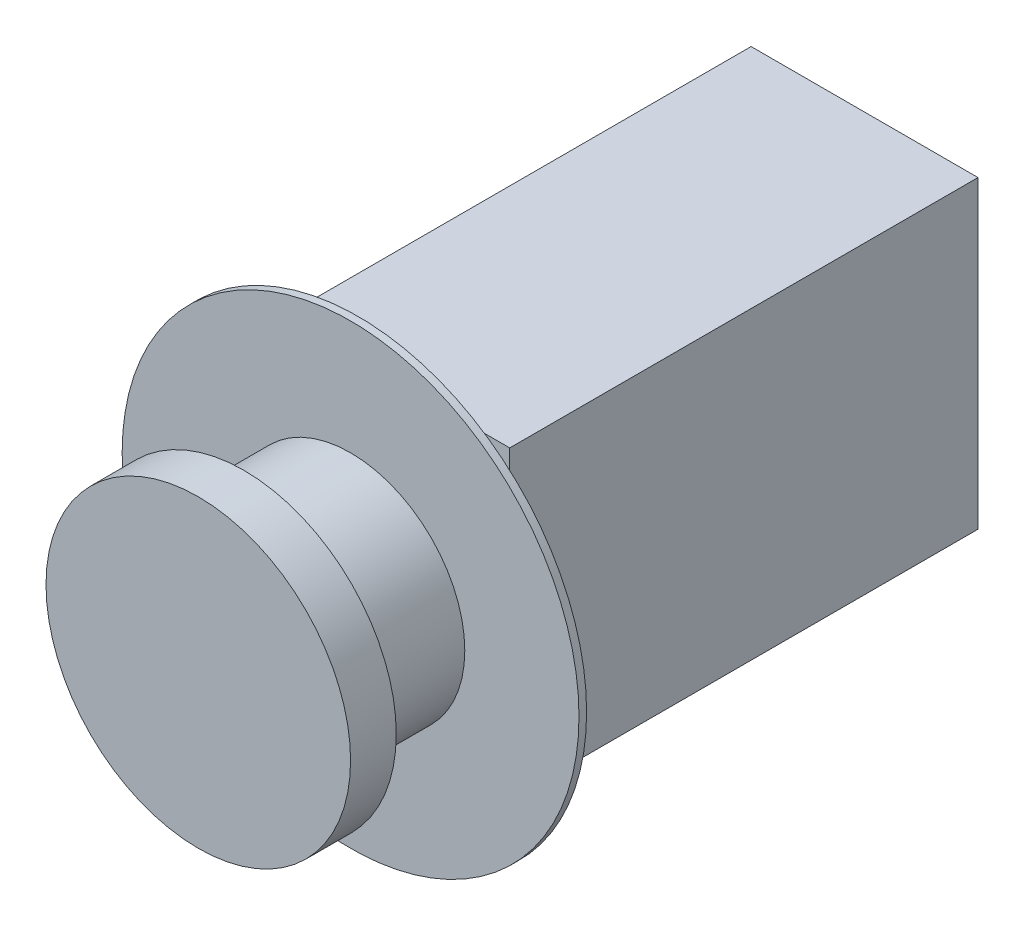
ISO-10303-21;
HEADER;
FILE_DESCRIPTION(('STEP AP214'),'2;1');
FILE_NAME('part.step','',(''),(''),'','','');
FILE_SCHEMA(('AUTOMOTIVE_DESIGN { 1 0 10303 214 1 1 1 1 }'));
ENDSEC;
DATA;
#1=APPLICATION_CONTEXT('core data for automotive mechanical design processes');
#2=APPLICATION_PROTOCOL_DEFINITION('international standard','automotive_design',2000,#1);
#3=PRODUCT_CONTEXT('',#1,'mechanical');
#4=PRODUCT('Part','Part','',(#3));
#5=PRODUCT_RELATED_PRODUCT_CATEGORY('part','',(#4));
#6=PRODUCT_DEFINITION_FORMATION('','',#4);
#7=PRODUCT_DEFINITION_CONTEXT('part definition',#1,'design');
#8=PRODUCT_DEFINITION('design','',#6,#7);
#9=PRODUCT_DEFINITION_SHAPE('','',#8);
#10=(LENGTH_UNIT() NAMED_UNIT(*) SI_UNIT(.MILLI.,.METRE.));
#11=(NAMED_UNIT(*) PLANE_ANGLE_UNIT() SI_UNIT($,.RADIAN.));
#12=(NAMED_UNIT(*) SI_UNIT($,.STERADIAN.) SOLID_ANGLE_UNIT());
#13=UNCERTAINTY_MEASURE_WITH_UNIT(LENGTH_MEASURE(1.E-05),#10,'distance_accuracy_value','');
#14=(GEOMETRIC_REPRESENTATION_CONTEXT(3) GLOBAL_UNCERTAINTY_ASSIGNED_CONTEXT((#13)) GLOBAL_UNIT_ASSIGNED_CONTEXT((#10,
#11,#12)) REPRESENTATION_CONTEXT('',''));
#15=CARTESIAN_POINT('',(0.,0.,0.));
#16=DIRECTION('',(0.,0.,1.));
#17=DIRECTION('',(1.,0.,0.));
#18=AXIS2_PLACEMENT_3D('',#15,#16,#17);
#19=CARTESIAN_POINT('',(0.,0.,-15.));
#20=DIRECTION('',(0.,0.,1.));
#21=DIRECTION('',(1.,0.,0.));
#22=AXIS2_PLACEMENT_3D('',#19,#20,#21);
#23=CYLINDRICAL_SURFACE('',#22,11.);
#24=CARTESIAN_POINT('',(0.,0.,0.));
#25=DIRECTION('',(0.,0.,1.));
#26=DIRECTION('',(1.,0.,0.));
#27=AXIS2_PLACEMENT_3D('',#24,#25,#26);
#28=CIRCLE('',#27,11.);
#29=CARTESIAN_POINT('',(11.,0.,0.));
#30=VERTEX_POINT('',#29);
#31=EDGE_CURVE('E121',#30,#30,#28,.F.);
#32=ORIENTED_EDGE('',*,*,#31,.T.);
#33=EDGE_LOOP('',(#32));
#34=FACE_BOUND('',#33,.T.);
#35=CARTESIAN_POINT('',(0.,0.,-5.));
#36=DIRECTION('',(0.,0.,-1.));
#37=DIRECTION('',(-1.,0.,0.));
#38=AXIS2_PLACEMENT_3D('',#35,#36,#37);
#39=CIRCLE('',#38,11.);
#40=CARTESIAN_POINT('',(-11.,0.,-5.));
#41=VERTEX_POINT('',#40);
#42=EDGE_CURVE('E43',#41,#41,#39,.T.);
#43=ORIENTED_EDGE('',*,*,#42,.F.);
#44=EDGE_LOOP('',(#43));
#45=FACE_BOUND('',#44,.T.);
#46=ADVANCED_FACE('F34',(#34,#45),#23,.T.);
#47=CARTESIAN_POINT('',(0.,0.,0.));
#48=DIRECTION('',(0.,0.,1.));
#49=DIRECTION('',(1.,0.,0.));
#50=AXIS2_PLACEMENT_3D('',#47,#48,#49);
#51=PLANE('',#50);
#52=ORIENTED_EDGE('',*,*,#31,.F.);
#53=EDGE_LOOP('',(#52));
#54=FACE_BOUND('',#53,.T.);
#55=CARTESIAN_POINT('',(0.,0.,0.));
#56=DIRECTION('',(0.,0.,-1.));
#57=DIRECTION('',(-1.,0.,0.));
#58=AXIS2_PLACEMENT_3D('',#55,#56,#57);
#59=CIRCLE('',#58,30.);
#60=CARTESIAN_POINT('',(-30.,0.,0.));
#61=VERTEX_POINT('',#60);
#62=EDGE_CURVE('E193',#61,#61,#59,.T.);
#63=ORIENTED_EDGE('',*,*,#62,.T.);
#64=EDGE_LOOP('',(#63));
#65=FACE_BOUND('',#64,.T.);
#66=ADVANCED_FACE('F129',(#54,#65),#51,.F.);
#67=CARTESIAN_POINT('',(0.,0.,-5.));
#68=DIRECTION('',(0.,0.,-1.));
#69=DIRECTION('',(-1.,0.,0.));
#70=AXIS2_PLACEMENT_3D('',#67,#68,#69);
#71=PLANE('',#70);
#72=DIRECTION('',(0.,1.,0.));
#73=VECTOR('',#72,1.);
#74=CARTESIAN_POINT('',(-14.9,20.,-5.));
#75=LINE('',#74,#73);
#76=CARTESIAN_POINT('',(-14.9,-20.,-5.));
#77=VERTEX_POINT('',#76);
#78=CARTESIAN_POINT('',(-14.9,20.,-5.));
#79=VERTEX_POINT('',#78);
#80=EDGE_CURVE('E102',#77,#79,#75,.T.);
#81=ORIENTED_EDGE('',*,*,#80,.F.);
#82=DIRECTION('',(-1.,0.,0.));
#83=VECTOR('',#82,1.);
#84=CARTESIAN_POINT('',(14.9,-20.,-5.));
#85=LINE('',#84,#83);
#86=CARTESIAN_POINT('',(14.9,-20.,-5.));
#87=VERTEX_POINT('',#86);
#88=EDGE_CURVE('E74',#87,#77,#85,.T.);
#89=ORIENTED_EDGE('',*,*,#88,.F.);
#90=DIRECTION('',(0.,-1.,0.));
#91=VECTOR('',#90,1.);
#92=CARTESIAN_POINT('',(14.9,20.,-5.));
#93=LINE('',#92,#91);
#94=CARTESIAN_POINT('',(14.9,20.,-5.));
#95=VERTEX_POINT('',#94);
#96=EDGE_CURVE('E68',#95,#87,#93,.T.);
#97=ORIENTED_EDGE('',*,*,#96,.F.);
#98=DIRECTION('',(1.,0.,0.));
#99=VECTOR('',#98,1.);
#100=CARTESIAN_POINT('',(14.9,20.,-5.));
#101=LINE('',#100,#99);
#102=EDGE_CURVE('E92',#79,#95,#101,.T.);
#103=ORIENTED_EDGE('',*,*,#102,.F.);
#104=EDGE_LOOP('',(#81,#89,#97,#103));
#105=FACE_BOUND('',#104,.T.);
#106=ORIENTED_EDGE('',*,*,#42,.T.);
#107=EDGE_LOOP('',(#106));
#108=FACE_BOUND('',#107,.T.);
#109=ADVANCED_FACE('F126',(#105,#108),#71,.F.);
#110=CARTESIAN_POINT('',(-14.9,20.,-66.5));
#111=DIRECTION('',(1.,0.,0.));
#112=DIRECTION('',(0.,1.,0.));
#113=AXIS2_PLACEMENT_3D('',#110,#111,#112);
#114=PLANE('',#113);
#115=ORIENTED_EDGE('',*,*,#80,.T.);
#116=DIRECTION('',(0.,0.,1.));
#117=VECTOR('',#116,1.);
#118=CARTESIAN_POINT('',(-14.9,20.,-66.5));
#119=LINE('',#118,#117);
#120=CARTESIAN_POINT('',(-14.9,20.,-66.5));
#121=VERTEX_POINT('',#120);
#122=EDGE_CURVE('E93',#121,#79,#119,.T.);
#123=ORIENTED_EDGE('',*,*,#122,.F.);
#124=DIRECTION('',(0.,1.,0.));
#125=VECTOR('',#124,1.);
#126=CARTESIAN_POINT('',(-14.9,20.,-66.5));
#127=LINE('',#126,#125);
#128=CARTESIAN_POINT('',(-14.9,-20.,-66.5));
#129=VERTEX_POINT('',#128);
#130=EDGE_CURVE('E87',#129,#121,#127,.T.);
#131=ORIENTED_EDGE('',*,*,#130,.F.);
#132=DIRECTION('',(0.,0.,1.));
#133=VECTOR('',#132,1.);
#134=CARTESIAN_POINT('',(-14.9,-20.,-66.5));
#135=LINE('',#134,#133);
#136=EDGE_CURVE('E98',#129,#77,#135,.T.);
#137=ORIENTED_EDGE('',*,*,#136,.T.);
#138=EDGE_LOOP('',(#115,#123,#131,#137));
#139=FACE_BOUND('',#138,.T.);
#140=ADVANCED_FACE('F138',(#139),#114,.F.);
#141=CARTESIAN_POINT('',(14.9,20.,-66.5));
#142=DIRECTION('',(0.,-1.,0.));
#143=DIRECTION('',(0.,0.,-1.));
#144=AXIS2_PLACEMENT_3D('',#141,#142,#143);
#145=PLANE('',#144);
#146=ORIENTED_EDGE('',*,*,#102,.T.);
#147=DIRECTION('',(0.,0.,1.));
#148=VECTOR('',#147,1.);
#149=CARTESIAN_POINT('',(14.9,20.,-66.5));
#150=LINE('',#149,#148);
#151=CARTESIAN_POINT('',(14.9,20.,-66.5));
#152=VERTEX_POINT('',#151);
#153=EDGE_CURVE('E90',#152,#95,#150,.T.);
#154=ORIENTED_EDGE('',*,*,#153,.F.);
#155=DIRECTION('',(1.,0.,0.));
#156=VECTOR('',#155,1.);
#157=CARTESIAN_POINT('',(14.9,20.,-66.5));
#158=LINE('',#157,#156);
#159=EDGE_CURVE('E82',#121,#152,#158,.T.);
#160=ORIENTED_EDGE('',*,*,#159,.F.);
#161=ORIENTED_EDGE('',*,*,#122,.T.);
#162=EDGE_LOOP('',(#146,#154,#160,#161));
#163=FACE_BOUND('',#162,.T.);
#164=ADVANCED_FACE('F91',(#163),#145,.F.);
#165=CARTESIAN_POINT('',(14.9,20.,-66.5));
#166=DIRECTION('',(-1.,0.,0.));
#167=DIRECTION('',(0.,-1.,0.));
#168=AXIS2_PLACEMENT_3D('',#165,#166,#167);
#169=PLANE('',#168);
#170=ORIENTED_EDGE('',*,*,#96,.T.);
#171=DIRECTION('',(0.,0.,1.));
#172=VECTOR('',#171,1.);
#173=CARTESIAN_POINT('',(14.9,-20.,-66.5));
#174=LINE('',#173,#172);
#175=CARTESIAN_POINT('',(14.9,-20.,-66.5));
#176=VERTEX_POINT('',#175);
#177=EDGE_CURVE('E94',#176,#87,#174,.T.);
#178=ORIENTED_EDGE('',*,*,#177,.F.);
#179=DIRECTION('',(0.,-1.,0.));
#180=VECTOR('',#179,1.);
#181=CARTESIAN_POINT('',(14.9,20.,-66.5));
#182=LINE('',#181,#180);
#183=EDGE_CURVE('E85',#152,#176,#182,.T.);
#184=ORIENTED_EDGE('',*,*,#183,.F.);
#185=ORIENTED_EDGE('',*,*,#153,.T.);
#186=EDGE_LOOP('',(#170,#178,#184,#185));
#187=FACE_BOUND('',#186,.T.);
#188=ADVANCED_FACE('F96',(#187),#169,.F.);
#189=CARTESIAN_POINT('',(14.9,-20.,-66.5));
#190=DIRECTION('',(0.,1.,0.));
#191=DIRECTION('',(0.,0.,1.));
#192=AXIS2_PLACEMENT_3D('',#189,#190,#191);
#193=PLANE('',#192);
#194=ORIENTED_EDGE('',*,*,#88,.T.);
#195=ORIENTED_EDGE('',*,*,#136,.F.);
#196=DIRECTION('',(-1.,0.,0.));
#197=VECTOR('',#196,1.);
#198=CARTESIAN_POINT('',(14.9,-20.,-66.5));
#199=LINE('',#198,#197);
#200=EDGE_CURVE('E51',#176,#129,#199,.T.);
#201=ORIENTED_EDGE('',*,*,#200,.F.);
#202=ORIENTED_EDGE('',*,*,#177,.T.);
#203=EDGE_LOOP('',(#194,#195,#201,#202));
#204=FACE_BOUND('',#203,.T.);
#205=ADVANCED_FACE('F174',(#204),#193,.F.);
#206=CARTESIAN_POINT('',(0.,0.,-66.5));
#207=DIRECTION('',(0.,0.,-1.));
#208=DIRECTION('',(-1.,0.,0.));
#209=AXIS2_PLACEMENT_3D('',#206,#207,#208);
#210=PLANE('',#209);
#211=ORIENTED_EDGE('',*,*,#130,.T.);
#212=ORIENTED_EDGE('',*,*,#159,.T.);
#213=ORIENTED_EDGE('',*,*,#183,.T.);
#214=ORIENTED_EDGE('',*,*,#200,.T.);
#215=EDGE_LOOP('',(#211,#212,#213,#214));
#216=FACE_BOUND('',#215,.T.);
#217=ADVANCED_FACE('F83',(#216),#210,.T.);
#218=CARTESIAN_POINT('',(0.,0.,1.));
#219=DIRECTION('',(0.,0.,-1.));
#220=DIRECTION('',(-1.,0.,0.));
#221=AXIS2_PLACEMENT_3D('',#218,#219,#220);
#222=PLANE('',#221);
#223=CARTESIAN_POINT('',(0.,0.,1.));
#224=DIRECTION('',(0.,0.,-1.));
#225=DIRECTION('',(-1.,0.,0.));
#226=AXIS2_PLACEMENT_3D('',#223,#224,#225);
#227=CIRCLE('',#226,30.);
#228=CARTESIAN_POINT('',(-30.,0.,1.));
#229=VERTEX_POINT('',#228);
#230=EDGE_CURVE('E105',#229,#229,#227,.T.);
#231=ORIENTED_EDGE('',*,*,#230,.F.);
#232=EDGE_LOOP('',(#231));
#233=FACE_BOUND('',#232,.T.);
#234=CARTESIAN_POINT('',(0.,0.,1.));
#235=DIRECTION('',(0.,0.,-1.));
#236=DIRECTION('',(-1.,0.,0.));
#237=AXIS2_PLACEMENT_3D('',#234,#235,#236);
#238=CIRCLE('',#237,15.);
#239=CARTESIAN_POINT('',(-15.,0.,1.));
#240=VERTEX_POINT('',#239);
#241=EDGE_CURVE('E11',#240,#240,#238,.T.);
#242=ORIENTED_EDGE('',*,*,#241,.T.);
#243=EDGE_LOOP('',(#242));
#244=FACE_BOUND('',#243,.T.);
#245=ADVANCED_FACE('F164',(#233,#244),#222,.F.);
#246=CARTESIAN_POINT('',(0.,0.,1.));
#247=DIRECTION('',(0.,0.,-1.));
#248=DIRECTION('',(-1.,0.,0.));
#249=AXIS2_PLACEMENT_3D('',#246,#247,#248);
#250=CYLINDRICAL_SURFACE('',#249,30.);
#251=ORIENTED_EDGE('',*,*,#230,.T.);
#252=EDGE_LOOP('',(#251));
#253=FACE_BOUND('',#252,.T.);
#254=ORIENTED_EDGE('',*,*,#62,.F.);
#255=EDGE_LOOP('',(#254));
#256=FACE_BOUND('',#255,.T.);
#257=ADVANCED_FACE('F144',(#253,#256),#250,.T.);
#258=CARTESIAN_POINT('',(0.,0.,21.));
#259=DIRECTION('',(0.,0.,1.));
#260=DIRECTION('',(1.,0.,0.));
#261=AXIS2_PLACEMENT_3D('',#258,#259,#260);
#262=PLANE('',#261);
#263=CARTESIAN_POINT('',(0.,0.,21.));
#264=DIRECTION('',(0.,0.,1.));
#265=DIRECTION('',(1.,0.,0.));
#266=AXIS2_PLACEMENT_3D('',#263,#264,#265);
#267=CIRCLE('',#266,20.);
#268=CARTESIAN_POINT('',(20.,0.,21.));
#269=VERTEX_POINT('',#268);
#270=EDGE_CURVE('E113',#269,#269,#267,.T.);
#271=ORIENTED_EDGE('',*,*,#270,.T.);
#272=EDGE_LOOP('',(#271));
#273=FACE_BOUND('',#272,.T.);
#274=ADVANCED_FACE('F140',(#273),#262,.T.);
#275=CARTESIAN_POINT('',(0.,0.,21.));
#276=DIRECTION('',(0.,0.,-1.));
#277=DIRECTION('',(-1.,0.,0.));
#278=AXIS2_PLACEMENT_3D('',#275,#276,#277);
#279=CYLINDRICAL_SURFACE('',#278,20.);
#280=ORIENTED_EDGE('',*,*,#270,.F.);
#281=EDGE_LOOP('',(#280));
#282=FACE_BOUND('',#281,.T.);
#283=CARTESIAN_POINT('',(0.,0.,15.));
#284=DIRECTION('',(0.,0.,1.));
#285=DIRECTION('',(1.,0.,0.));
#286=AXIS2_PLACEMENT_3D('',#283,#284,#285);
#287=CIRCLE('',#286,20.);
#288=CARTESIAN_POINT('',(20.,0.,15.));
#289=VERTEX_POINT('',#288);
#290=EDGE_CURVE('E112',#289,#289,#287,.T.);
#291=ORIENTED_EDGE('',*,*,#290,.T.);
#292=EDGE_LOOP('',(#291));
#293=FACE_BOUND('',#292,.T.);
#294=ADVANCED_FACE('F143',(#282,#293),#279,.T.);
#295=CARTESIAN_POINT('',(0.,0.,15.));
#296=DIRECTION('',(0.,0.,1.));
#297=DIRECTION('',(1.,0.,0.));
#298=AXIS2_PLACEMENT_3D('',#295,#296,#297);
#299=PLANE('',#298);
#300=ORIENTED_EDGE('',*,*,#290,.F.);
#301=EDGE_LOOP('',(#300));
#302=FACE_BOUND('',#301,.T.);
#303=CARTESIAN_POINT('',(0.,0.,15.));
#304=DIRECTION('',(0.,0.,1.));
#305=DIRECTION('',(1.,0.,0.));
#306=AXIS2_PLACEMENT_3D('',#303,#304,#305);
#307=CIRCLE('',#306,15.);
#308=CARTESIAN_POINT('',(15.,0.,15.));
#309=VERTEX_POINT('',#308);
#310=EDGE_CURVE('E116',#309,#309,#307,.T.);
#311=ORIENTED_EDGE('',*,*,#310,.T.);
#312=EDGE_LOOP('',(#311));
#313=FACE_BOUND('',#312,.T.);
#314=ADVANCED_FACE('F146',(#302,#313),#299,.F.);
#315=CARTESIAN_POINT('',(0.,0.,15.));
#316=DIRECTION('',(0.,0.,-1.));
#317=DIRECTION('',(-1.,0.,0.));
#318=AXIS2_PLACEMENT_3D('',#315,#316,#317);
#319=CYLINDRICAL_SURFACE('',#318,15.);
#320=ORIENTED_EDGE('',*,*,#310,.F.);
#321=EDGE_LOOP('',(#320));
#322=FACE_BOUND('',#321,.T.);
#323=ORIENTED_EDGE('',*,*,#241,.F.);
#324=EDGE_LOOP('',(#323));
#325=FACE_BOUND('',#324,.T.);
#326=ADVANCED_FACE('F36',(#322,#325),#319,.T.);
#327=CLOSED_SHELL('',(#46,#66,#109,#140,#164,#188,#205,#217,#245,#257,#274,#294,#314,#326));
#328=MANIFOLD_SOLID_BREP('B2',#327);
#329=ADVANCED_BREP_SHAPE_REPRESENTATION('',(#18,#328),#14);
#330=SHAPE_DEFINITION_REPRESENTATION(#9,#329);
ENDSEC;
END-ISO-10303-21;
